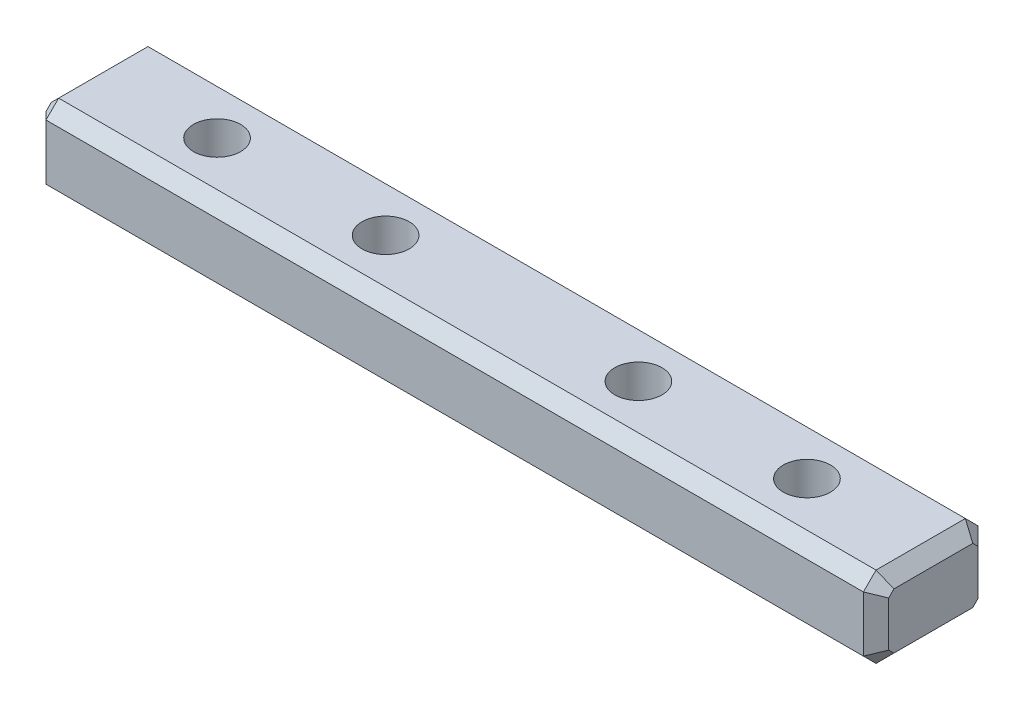
ISO-10303-21;
HEADER;
FILE_DESCRIPTION(('STEP AP214'),'2;1');
FILE_NAME('part.step','',(''),(''),'','','');
FILE_SCHEMA(('AUTOMOTIVE_DESIGN { 1 0 10303 214 1 1 1 1 }'));
ENDSEC;
DATA;
#1=APPLICATION_CONTEXT('core data for automotive mechanical design processes');
#2=APPLICATION_PROTOCOL_DEFINITION('international standard','automotive_design',2000,#1);
#3=PRODUCT_CONTEXT('',#1,'mechanical');
#4=PRODUCT('Part','Part','',(#3));
#5=PRODUCT_RELATED_PRODUCT_CATEGORY('part','',(#4));
#6=PRODUCT_DEFINITION_FORMATION('','',#4);
#7=PRODUCT_DEFINITION_CONTEXT('part definition',#1,'design');
#8=PRODUCT_DEFINITION('design','',#6,#7);
#9=PRODUCT_DEFINITION_SHAPE('','',#8);
#10=(LENGTH_UNIT() NAMED_UNIT(*) SI_UNIT(.MILLI.,.METRE.));
#11=(NAMED_UNIT(*) PLANE_ANGLE_UNIT() SI_UNIT($,.RADIAN.));
#12=(NAMED_UNIT(*) SI_UNIT($,.STERADIAN.) SOLID_ANGLE_UNIT());
#13=UNCERTAINTY_MEASURE_WITH_UNIT(LENGTH_MEASURE(1.E-05),#10,'distance_accuracy_value','');
#14=(GEOMETRIC_REPRESENTATION_CONTEXT(3) GLOBAL_UNCERTAINTY_ASSIGNED_CONTEXT((#13)) GLOBAL_UNIT_ASSIGNED_CONTEXT((#10,
#11,#12)) REPRESENTATION_CONTEXT('',''));
#15=CARTESIAN_POINT('',(0.,0.,0.));
#16=DIRECTION('',(0.,0.,1.));
#17=DIRECTION('',(1.,0.,0.));
#18=AXIS2_PLACEMENT_3D('',#15,#16,#17);
#19=CARTESIAN_POINT('',(0.,4.8,-6.8));
#20=DIRECTION('',(0.,1.,0.));
#21=DIRECTION('',(0.,0.,-1.));
#22=AXIS2_PLACEMENT_3D('',#19,#20,#21);
#23=PLANE('',#22);
#24=CARTESIAN_POINT('',(35.,4.8,0.));
#25=DIRECTION('',(0.,-1.,0.));
#26=DIRECTION('',(1.,0.,0.));
#27=AXIS2_PLACEMENT_3D('',#24,#25,#26);
#28=CIRCLE('',#27,2.8);
#29=CARTESIAN_POINT('',(32.2,4.8,0.));
#30=VERTEX_POINT('',#29);
#31=EDGE_CURVE('E11',#30,#30,#28,.T.);
#32=ORIENTED_EDGE('',*,*,#31,.T.);
#33=EDGE_LOOP('',(#32));
#34=FACE_BOUND('',#33,.T.);
#35=CARTESIAN_POINT('',(-35.,4.8,0.));
#36=DIRECTION('',(0.,-1.,0.));
#37=DIRECTION('',(1.,0.,0.));
#38=AXIS2_PLACEMENT_3D('',#35,#36,#37);
#39=CIRCLE('',#38,2.8);
#40=CARTESIAN_POINT('',(-37.8,4.8,0.));
#41=VERTEX_POINT('',#40);
#42=EDGE_CURVE('E40',#41,#41,#39,.T.);
#43=ORIENTED_EDGE('',*,*,#42,.T.);
#44=EDGE_LOOP('',(#43));
#45=FACE_BOUND('',#44,.T.);
#46=CARTESIAN_POINT('',(15.,4.8,0.));
#47=DIRECTION('',(0.,-1.,0.));
#48=DIRECTION('',(1.,0.,0.));
#49=AXIS2_PLACEMENT_3D('',#46,#47,#48);
#50=CIRCLE('',#49,2.8);
#51=CARTESIAN_POINT('',(12.2,4.8,0.));
#52=VERTEX_POINT('',#51);
#53=EDGE_CURVE('E447',#52,#52,#50,.T.);
#54=ORIENTED_EDGE('',*,*,#53,.T.);
#55=EDGE_LOOP('',(#54));
#56=FACE_BOUND('',#55,.T.);
#57=CARTESIAN_POINT('',(-15.,4.8,0.));
#58=DIRECTION('',(0.,-1.,0.));
#59=DIRECTION('',(1.,0.,0.));
#60=AXIS2_PLACEMENT_3D('',#57,#58,#59);
#61=CIRCLE('',#60,2.8);
#62=CARTESIAN_POINT('',(-17.8,4.8,0.));
#63=VERTEX_POINT('',#62);
#64=EDGE_CURVE('E440',#63,#63,#61,.T.);
#65=ORIENTED_EDGE('',*,*,#64,.T.);
#66=EDGE_LOOP('',(#65));
#67=FACE_BOUND('',#66,.T.);
#68=DIRECTION('',(0.,0.,-1.));
#69=VECTOR('',#68,1.);
#70=CARTESIAN_POINT('',(-48.5,4.8,-3.4));
#71=LINE('',#70,#69);
#72=CARTESIAN_POINT('',(-48.5,4.8,5.3));
#73=VERTEX_POINT('',#72);
#74=CARTESIAN_POINT('',(-48.5,4.8,-5.3));
#75=VERTEX_POINT('',#74);
#76=EDGE_CURVE('E248',#73,#75,#71,.T.);
#77=ORIENTED_EDGE('',*,*,#76,.F.);
#78=DIRECTION('',(-1.,0.,0.));
#79=VECTOR('',#78,1.);
#80=CARTESIAN_POINT('',(0.,4.8,5.3));
#81=LINE('',#80,#79);
#82=CARTESIAN_POINT('',(48.5,4.8,5.3));
#83=VERTEX_POINT('',#82);
#84=EDGE_CURVE('E323',#83,#73,#81,.T.);
#85=ORIENTED_EDGE('',*,*,#84,.F.);
#86=DIRECTION('',(0.,0.,1.));
#87=VECTOR('',#86,1.);
#88=CARTESIAN_POINT('',(48.5,4.8,-3.4));
#89=LINE('',#88,#87);
#90=CARTESIAN_POINT('',(48.5,4.8,-5.3));
#91=VERTEX_POINT('',#90);
#92=EDGE_CURVE('E373',#91,#83,#89,.T.);
#93=ORIENTED_EDGE('',*,*,#92,.F.);
#94=DIRECTION('',(1.,0.,0.));
#95=VECTOR('',#94,1.);
#96=CARTESIAN_POINT('',(0.,4.8,-5.3));
#97=LINE('',#96,#95);
#98=EDGE_CURVE('E356',#75,#91,#97,.T.);
#99=ORIENTED_EDGE('',*,*,#98,.F.);
#100=EDGE_LOOP('',(#77,#85,#93,#99));
#101=FACE_BOUND('',#100,.T.);
#102=ADVANCED_FACE('F17',(#34,#45,#56,#67,#101),#23,.T.);
#103=CARTESIAN_POINT('',(35.,-4.8,0.));
#104=DIRECTION('',(0.,1.,0.));
#105=DIRECTION('',(1.,0.,0.));
#106=AXIS2_PLACEMENT_3D('',#103,#104,#105);
#107=CYLINDRICAL_SURFACE('',#106,2.8);
#108=CARTESIAN_POINT('',(35.,-4.8,0.));
#109=DIRECTION('',(0.,1.,0.));
#110=DIRECTION('',(1.,0.,0.));
#111=AXIS2_PLACEMENT_3D('',#108,#109,#110);
#112=CIRCLE('',#111,2.8);
#113=CARTESIAN_POINT('',(32.2,-4.8,0.));
#114=VERTEX_POINT('',#113);
#115=EDGE_CURVE('E266',#114,#114,#112,.T.);
#116=ORIENTED_EDGE('',*,*,#115,.F.);
#117=DIRECTION('',(0.,1.,0.));
#118=VECTOR('',#117,1.);
#119=CARTESIAN_POINT('',(32.2,-4.8,0.));
#120=LINE('',#119,#118);
#121=EDGE_CURVE('E25',#114,#30,#120,.T.);
#122=ORIENTED_EDGE('',*,*,#121,.T.);
#123=ORIENTED_EDGE('',*,*,#31,.F.);
#124=ORIENTED_EDGE('',*,*,#121,.F.);
#125=EDGE_LOOP('',(#116,#122,#123,#124));
#126=FACE_BOUND('',#125,.T.);
#127=ADVANCED_FACE('F535',(#126),#107,.F.);
#128=CARTESIAN_POINT('',(-35.,-4.8,0.));
#129=DIRECTION('',(0.,1.,0.));
#130=DIRECTION('',(1.,0.,0.));
#131=AXIS2_PLACEMENT_3D('',#128,#129,#130);
#132=CYLINDRICAL_SURFACE('',#131,2.8);
#133=CARTESIAN_POINT('',(-35.,-4.8,0.));
#134=DIRECTION('',(0.,1.,0.));
#135=DIRECTION('',(1.,0.,0.));
#136=AXIS2_PLACEMENT_3D('',#133,#134,#135);
#137=CIRCLE('',#136,2.8);
#138=CARTESIAN_POINT('',(-37.8,-4.8,0.));
#139=VERTEX_POINT('',#138);
#140=EDGE_CURVE('E270',#139,#139,#137,.T.);
#141=ORIENTED_EDGE('',*,*,#140,.F.);
#142=DIRECTION('',(0.,1.,0.));
#143=VECTOR('',#142,1.);
#144=CARTESIAN_POINT('',(-37.8,-4.8,0.));
#145=LINE('',#144,#143);
#146=EDGE_CURVE('E409',#139,#41,#145,.T.);
#147=ORIENTED_EDGE('',*,*,#146,.T.);
#148=ORIENTED_EDGE('',*,*,#42,.F.);
#149=ORIENTED_EDGE('',*,*,#146,.F.);
#150=EDGE_LOOP('',(#141,#147,#148,#149));
#151=FACE_BOUND('',#150,.T.);
#152=ADVANCED_FACE('F455',(#151),#132,.F.);
#153=CARTESIAN_POINT('',(15.,-4.8,0.));
#154=DIRECTION('',(0.,1.,0.));
#155=DIRECTION('',(1.,0.,0.));
#156=AXIS2_PLACEMENT_3D('',#153,#154,#155);
#157=CYLINDRICAL_SURFACE('',#156,2.8);
#158=CARTESIAN_POINT('',(15.,-4.8,0.));
#159=DIRECTION('',(0.,1.,0.));
#160=DIRECTION('',(1.,0.,0.));
#161=AXIS2_PLACEMENT_3D('',#158,#159,#160);
#162=CIRCLE('',#161,2.8);
#163=CARTESIAN_POINT('',(12.2,-4.8,0.));
#164=VERTEX_POINT('',#163);
#165=EDGE_CURVE('E364',#164,#164,#162,.T.);
#166=ORIENTED_EDGE('',*,*,#165,.F.);
#167=DIRECTION('',(0.,1.,0.));
#168=VECTOR('',#167,1.);
#169=CARTESIAN_POINT('',(12.2,-4.8,0.));
#170=LINE('',#169,#168);
#171=EDGE_CURVE('E443',#164,#52,#170,.T.);
#172=ORIENTED_EDGE('',*,*,#171,.T.);
#173=ORIENTED_EDGE('',*,*,#53,.F.);
#174=ORIENTED_EDGE('',*,*,#171,.F.);
#175=EDGE_LOOP('',(#166,#172,#173,#174));
#176=FACE_BOUND('',#175,.T.);
#177=ADVANCED_FACE('F543',(#176),#157,.F.);
#178=CARTESIAN_POINT('',(-15.,-4.8,0.));
#179=DIRECTION('',(0.,1.,0.));
#180=DIRECTION('',(1.,0.,0.));
#181=AXIS2_PLACEMENT_3D('',#178,#179,#180);
#182=CYLINDRICAL_SURFACE('',#181,2.8);
#183=CARTESIAN_POINT('',(-15.,-4.8,0.));
#184=DIRECTION('',(0.,1.,0.));
#185=DIRECTION('',(1.,0.,0.));
#186=AXIS2_PLACEMENT_3D('',#183,#184,#185);
#187=CIRCLE('',#186,2.8);
#188=CARTESIAN_POINT('',(-17.8,-4.8,0.));
#189=VERTEX_POINT('',#188);
#190=EDGE_CURVE('E247',#189,#189,#187,.T.);
#191=ORIENTED_EDGE('',*,*,#190,.F.);
#192=DIRECTION('',(0.,1.,0.));
#193=VECTOR('',#192,1.);
#194=CARTESIAN_POINT('',(-17.8,-4.8,0.));
#195=LINE('',#194,#193);
#196=EDGE_CURVE('E436',#189,#63,#195,.T.);
#197=ORIENTED_EDGE('',*,*,#196,.T.);
#198=ORIENTED_EDGE('',*,*,#64,.F.);
#199=ORIENTED_EDGE('',*,*,#196,.F.);
#200=EDGE_LOOP('',(#191,#197,#198,#199));
#201=FACE_BOUND('',#200,.T.);
#202=ADVANCED_FACE('F548',(#201),#182,.F.);
#203=CARTESIAN_POINT('',(0.,-4.8,-6.8));
#204=DIRECTION('',(0.,0.,-1.));
#205=DIRECTION('',(0.,-1.,0.));
#206=AXIS2_PLACEMENT_3D('',#203,#204,#205);
#207=PLANE('',#206);
#208=DIRECTION('',(0.,-1.,0.));
#209=VECTOR('',#208,1.);
#210=CARTESIAN_POINT('',(-48.5,-2.4,-6.8));
#211=LINE('',#210,#209);
#212=CARTESIAN_POINT('',(-48.5,3.3,-6.8));
#213=VERTEX_POINT('',#212);
#214=CARTESIAN_POINT('',(-48.5,-3.3,-6.8));
#215=VERTEX_POINT('',#214);
#216=EDGE_CURVE('E272',#213,#215,#211,.T.);
#217=ORIENTED_EDGE('',*,*,#216,.F.);
#218=DIRECTION('',(-1.,0.,0.));
#219=VECTOR('',#218,1.);
#220=CARTESIAN_POINT('',(0.,3.3,-6.8));
#221=LINE('',#220,#219);
#222=CARTESIAN_POINT('',(48.5,3.3,-6.8));
#223=VERTEX_POINT('',#222);
#224=EDGE_CURVE('E359',#223,#213,#221,.T.);
#225=ORIENTED_EDGE('',*,*,#224,.F.);
#226=DIRECTION('',(0.,1.,0.));
#227=VECTOR('',#226,1.);
#228=CARTESIAN_POINT('',(48.5,-2.4,-6.8));
#229=LINE('',#228,#227);
#230=CARTESIAN_POINT('',(48.5,-3.3,-6.8));
#231=VERTEX_POINT('',#230);
#232=EDGE_CURVE('E306',#231,#223,#229,.T.);
#233=ORIENTED_EDGE('',*,*,#232,.F.);
#234=DIRECTION('',(1.,0.,0.));
#235=VECTOR('',#234,1.);
#236=CARTESIAN_POINT('',(0.,-3.3,-6.8));
#237=LINE('',#236,#235);
#238=EDGE_CURVE('E360',#215,#231,#237,.T.);
#239=ORIENTED_EDGE('',*,*,#238,.F.);
#240=EDGE_LOOP('',(#217,#225,#233,#239));
#241=FACE_BOUND('',#240,.T.);
#242=ADVANCED_FACE('F522',(#241),#207,.T.);
#243=CARTESIAN_POINT('',(0.,4.05,-6.05));
#244=DIRECTION('',(0.,0.707106781186548,-0.707106781186548));
#245=DIRECTION('',(-1.,0.,0.));
#246=AXIS2_PLACEMENT_3D('',#243,#244,#245);
#247=PLANE('',#246);
#248=DIRECTION('',(0.,-0.707106781186548,-0.707106781186548));
#249=VECTOR('',#248,1.);
#250=CARTESIAN_POINT('',(-48.5,4.55,-5.55));
#251=LINE('',#250,#249);
#252=EDGE_CURVE('E276',#75,#213,#251,.T.);
#253=ORIENTED_EDGE('',*,*,#252,.F.);
#254=ORIENTED_EDGE('',*,*,#98,.T.);
#255=DIRECTION('',(0.,0.707106781186548,0.707106781186548));
#256=VECTOR('',#255,1.);
#257=CARTESIAN_POINT('',(48.5,4.55,-5.55));
#258=LINE('',#257,#256);
#259=EDGE_CURVE('E376',#223,#91,#258,.T.);
#260=ORIENTED_EDGE('',*,*,#259,.F.);
#261=ORIENTED_EDGE('',*,*,#224,.T.);
#262=EDGE_LOOP('',(#253,#254,#260,#261));
#263=FACE_BOUND('',#262,.T.);
#264=ADVANCED_FACE('F512',(#263),#247,.T.);
#265=CARTESIAN_POINT('',(50.,0.,0.));
#266=DIRECTION('',(1.,0.,0.));
#267=DIRECTION('',(0.,1.,0.));
#268=AXIS2_PLACEMENT_3D('',#265,#266,#267);
#269=PLANE('',#268);
#270=DIRECTION('',(0.,1.,0.));
#271=VECTOR('',#270,1.);
#272=CARTESIAN_POINT('',(50.,2.4,5.3));
#273=LINE('',#272,#271);
#274=CARTESIAN_POINT('',(50.,-2.67867965644036,5.3));
#275=VERTEX_POINT('',#274);
#276=CARTESIAN_POINT('',(50.,2.67867965644035,5.3));
#277=VERTEX_POINT('',#276);
#278=EDGE_CURVE('E242',#275,#277,#273,.T.);
#279=ORIENTED_EDGE('',*,*,#278,.F.);
#280=DIRECTION('',(0.,0.707106781186548,0.707106781186547));
#281=VECTOR('',#280,1.);
#282=CARTESIAN_POINT('',(50.,-3.48933982822018,4.48933982822018));
#283=LINE('',#282,#281);
#284=CARTESIAN_POINT('',(50.,-3.3,4.67867965644036));
#285=VERTEX_POINT('',#284);
#286=EDGE_CURVE('E429',#285,#275,#283,.T.);
#287=ORIENTED_EDGE('',*,*,#286,.F.);
#288=DIRECTION('',(0.,0.,1.));
#289=VECTOR('',#288,1.);
#290=CARTESIAN_POINT('',(50.,-3.3,3.4));
#291=LINE('',#290,#289);
#292=CARTESIAN_POINT('',(50.,-3.3,-4.67867965644036));
#293=VERTEX_POINT('',#292);
#294=EDGE_CURVE('E240',#293,#285,#291,.T.);
#295=ORIENTED_EDGE('',*,*,#294,.F.);
#296=DIRECTION('',(0.,-0.707106781186547,0.707106781186548));
#297=VECTOR('',#296,1.);
#298=CARTESIAN_POINT('',(50.,-3.48933982822018,-4.48933982822018));
#299=LINE('',#298,#297);
#300=CARTESIAN_POINT('',(50.,-2.67867965644036,-5.3));
#301=VERTEX_POINT('',#300);
#302=EDGE_CURVE('E241',#301,#293,#299,.T.);
#303=ORIENTED_EDGE('',*,*,#302,.F.);
#304=DIRECTION('',(0.,-1.,0.));
#305=VECTOR('',#304,1.);
#306=CARTESIAN_POINT('',(50.,-2.4,-5.3));
#307=LINE('',#306,#305);
#308=CARTESIAN_POINT('',(50.,2.67867965644036,-5.3));
#309=VERTEX_POINT('',#308);
#310=EDGE_CURVE('E295',#309,#301,#307,.T.);
#311=ORIENTED_EDGE('',*,*,#310,.F.);
#312=DIRECTION('',(0.,-0.707106781186548,-0.707106781186548));
#313=VECTOR('',#312,1.);
#314=CARTESIAN_POINT('',(50.,3.48933982822018,-4.48933982822018));
#315=LINE('',#314,#313);
#316=CARTESIAN_POINT('',(50.,3.3,-4.67867965644036));
#317=VERTEX_POINT('',#316);
#318=EDGE_CURVE('E413',#317,#309,#315,.T.);
#319=ORIENTED_EDGE('',*,*,#318,.F.);
#320=DIRECTION('',(0.,0.,-1.));
#321=VECTOR('',#320,1.);
#322=CARTESIAN_POINT('',(50.,3.3,-3.4));
#323=LINE('',#322,#321);
#324=CARTESIAN_POINT('',(50.,3.3,4.67867965644035));
#325=VERTEX_POINT('',#324);
#326=EDGE_CURVE('E332',#325,#317,#323,.T.);
#327=ORIENTED_EDGE('',*,*,#326,.F.);
#328=DIRECTION('',(0.,0.707106781186547,-0.707106781186548));
#329=VECTOR('',#328,1.);
#330=CARTESIAN_POINT('',(50.,3.48933982822018,4.48933982822018));
#331=LINE('',#330,#329);
#332=EDGE_CURVE('E397',#277,#325,#331,.T.);
#333=ORIENTED_EDGE('',*,*,#332,.F.);
#334=EDGE_LOOP('',(#279,#287,#295,#303,#311,#319,#327,#333));
#335=FACE_BOUND('',#334,.T.);
#336=ADVANCED_FACE('F557',(#335),#269,.T.);
#337=CARTESIAN_POINT('',(0.,-4.05,-6.05));
#338=DIRECTION('',(0.,-0.707106781186548,-0.707106781186547));
#339=DIRECTION('',(0.,0.707106781186547,-0.707106781186548));
#340=AXIS2_PLACEMENT_3D('',#337,#338,#339);
#341=PLANE('',#340);
#342=DIRECTION('',(0.,-0.707106781186547,0.707106781186548));
#343=VECTOR('',#342,1.);
#344=CARTESIAN_POINT('',(-48.5,-4.55,-5.55));
#345=LINE('',#344,#343);
#346=CARTESIAN_POINT('',(-48.5,-4.8,-5.3));
#347=VERTEX_POINT('',#346);
#348=EDGE_CURVE('E281',#215,#347,#345,.T.);
#349=ORIENTED_EDGE('',*,*,#348,.F.);
#350=ORIENTED_EDGE('',*,*,#238,.T.);
#351=DIRECTION('',(0.,0.707106781186547,-0.707106781186548));
#352=VECTOR('',#351,1.);
#353=CARTESIAN_POINT('',(48.5,-4.55,-5.55));
#354=LINE('',#353,#352);
#355=CARTESIAN_POINT('',(48.5,-4.8,-5.3));
#356=VERTEX_POINT('',#355);
#357=EDGE_CURVE('E261',#356,#231,#354,.T.);
#358=ORIENTED_EDGE('',*,*,#357,.F.);
#359=DIRECTION('',(-1.,0.,0.));
#360=VECTOR('',#359,1.);
#361=CARTESIAN_POINT('',(0.,-4.8,-5.3));
#362=LINE('',#361,#360);
#363=EDGE_CURVE('E380',#356,#347,#362,.T.);
#364=ORIENTED_EDGE('',*,*,#363,.T.);
#365=EDGE_LOOP('',(#349,#350,#358,#364));
#366=FACE_BOUND('',#365,.T.);
#367=ADVANCED_FACE('F474',(#366),#341,.T.);
#368=CARTESIAN_POINT('',(49.25,-4.01966991411009,5.01966991411009));
#369=DIRECTION('',(0.707106781186547,-0.5,0.5));
#370=DIRECTION('',(0.,-0.707106781186548,-0.707106781186547));
#371=AXIS2_PLACEMENT_3D('',#368,#369,#370);
#372=PLANE('',#371);
#373=DIRECTION('',(0.,-0.707106781186548,-0.707106781186547));
#374=VECTOR('',#373,1.);
#375=CARTESIAN_POINT('',(48.5,-4.55,5.55));
#376=LINE('',#375,#374);
#377=CARTESIAN_POINT('',(48.5,-3.3,6.8));
#378=VERTEX_POINT('',#377);
#379=CARTESIAN_POINT('',(48.5,-4.8,5.3));
#380=VERTEX_POINT('',#379);
#381=EDGE_CURVE('E372',#378,#380,#376,.T.);
#382=ORIENTED_EDGE('',*,*,#381,.T.);
#383=DIRECTION('',(-0.678598344545848,-0.678598344545846,0.28108463771482));
#384=VECTOR('',#383,1.);
#385=CARTESIAN_POINT('',(50.,-3.3,4.67867965644036));
#386=LINE('',#385,#384);
#387=EDGE_CURVE('E426',#285,#380,#386,.T.);
#388=ORIENTED_EDGE('',*,*,#387,.F.);
#389=ORIENTED_EDGE('',*,*,#286,.T.);
#390=DIRECTION('',(-0.678598344545848,-0.28108463771482,0.678598344545846));
#391=VECTOR('',#390,1.);
#392=CARTESIAN_POINT('',(50.,-2.67867965644036,5.3));
#393=LINE('',#392,#391);
#394=EDGE_CURVE('E394',#275,#378,#393,.T.);
#395=ORIENTED_EDGE('',*,*,#394,.T.);
#396=EDGE_LOOP('',(#382,#388,#389,#395));
#397=FACE_BOUND('',#396,.T.);
#398=ADVANCED_FACE('F484',(#397),#372,.T.);
#399=CARTESIAN_POINT('',(49.25,-4.05,3.4));
#400=DIRECTION('',(0.707106781186547,-0.707106781186548,0.));
#401=DIRECTION('',(0.,0.,-1.));
#402=AXIS2_PLACEMENT_3D('',#399,#400,#401);
#403=PLANE('',#402);
#404=DIRECTION('',(0.,0.,-1.));
#405=VECTOR('',#404,1.);
#406=CARTESIAN_POINT('',(48.5,-4.8,3.4));
#407=LINE('',#406,#405);
#408=EDGE_CURVE('E271',#380,#356,#407,.T.);
#409=ORIENTED_EDGE('',*,*,#408,.T.);
#410=DIRECTION('',(-0.678598344545848,-0.678598344545846,-0.28108463771482));
#411=VECTOR('',#410,1.);
#412=CARTESIAN_POINT('',(50.,-3.3,-4.67867965644036));
#413=LINE('',#412,#411);
#414=EDGE_CURVE('E237',#293,#356,#413,.T.);
#415=ORIENTED_EDGE('',*,*,#414,.F.);
#416=ORIENTED_EDGE('',*,*,#294,.T.);
#417=ORIENTED_EDGE('',*,*,#387,.T.);
#418=EDGE_LOOP('',(#409,#415,#416,#417));
#419=FACE_BOUND('',#418,.T.);
#420=ADVANCED_FACE('F480',(#419),#403,.T.);
#421=CARTESIAN_POINT('',(49.25,-4.01966991411009,-5.01966991411009));
#422=DIRECTION('',(0.707106781186547,-0.5,-0.5));
#423=DIRECTION('',(0.,0.707106781186547,-0.707106781186548));
#424=AXIS2_PLACEMENT_3D('',#421,#422,#423);
#425=PLANE('',#424);
#426=ORIENTED_EDGE('',*,*,#357,.T.);
#427=DIRECTION('',(-0.678598344545848,-0.281084637714821,-0.678598344545846));
#428=VECTOR('',#427,1.);
#429=CARTESIAN_POINT('',(50.,-2.67867965644036,-5.3));
#430=LINE('',#429,#428);
#431=EDGE_CURVE('E265',#301,#231,#430,.T.);
#432=ORIENTED_EDGE('',*,*,#431,.F.);
#433=ORIENTED_EDGE('',*,*,#302,.T.);
#434=ORIENTED_EDGE('',*,*,#414,.T.);
#435=EDGE_LOOP('',(#426,#432,#433,#434));
#436=FACE_BOUND('',#435,.T.);
#437=ADVANCED_FACE('F565',(#436),#425,.T.);
#438=CARTESIAN_POINT('',(49.25,-2.4,-6.05));
#439=DIRECTION('',(0.707106781186547,0.,-0.707106781186548));
#440=DIRECTION('',(0.,-1.,0.));
#441=AXIS2_PLACEMENT_3D('',#438,#439,#440);
#442=PLANE('',#441);
#443=ORIENTED_EDGE('',*,*,#232,.T.);
#444=DIRECTION('',(-0.678598344545848,0.28108463771482,-0.678598344545846));
#445=VECTOR('',#444,1.);
#446=CARTESIAN_POINT('',(50.,2.67867965644036,-5.3));
#447=LINE('',#446,#445);
#448=EDGE_CURVE('E310',#309,#223,#447,.T.);
#449=ORIENTED_EDGE('',*,*,#448,.F.);
#450=ORIENTED_EDGE('',*,*,#310,.T.);
#451=ORIENTED_EDGE('',*,*,#431,.T.);
#452=EDGE_LOOP('',(#443,#449,#450,#451));
#453=FACE_BOUND('',#452,.T.);
#454=ADVANCED_FACE('F518',(#453),#442,.T.);
#455=CARTESIAN_POINT('',(49.25,4.01966991411009,-5.01966991411009));
#456=DIRECTION('',(0.707106781186547,0.5,-0.5));
#457=DIRECTION('',(0.,-0.707106781186548,-0.707106781186548));
#458=AXIS2_PLACEMENT_3D('',#455,#456,#457);
#459=PLANE('',#458);
#460=ORIENTED_EDGE('',*,*,#259,.T.);
#461=DIRECTION('',(-0.678598344545848,0.678598344545846,-0.28108463771482));
#462=VECTOR('',#461,1.);
#463=CARTESIAN_POINT('',(50.,3.3,-4.67867965644036));
#464=LINE('',#463,#462);
#465=EDGE_CURVE('E336',#317,#91,#464,.T.);
#466=ORIENTED_EDGE('',*,*,#465,.F.);
#467=ORIENTED_EDGE('',*,*,#318,.T.);
#468=ORIENTED_EDGE('',*,*,#448,.T.);
#469=EDGE_LOOP('',(#460,#466,#467,#468));
#470=FACE_BOUND('',#469,.T.);
#471=ADVANCED_FACE('F515',(#470),#459,.T.);
#472=CARTESIAN_POINT('',(49.25,4.05,-3.4));
#473=DIRECTION('',(0.707106781186547,0.707106781186548,0.));
#474=DIRECTION('',(0.,0.,-1.));
#475=AXIS2_PLACEMENT_3D('',#472,#473,#474);
#476=PLANE('',#475);
#477=ORIENTED_EDGE('',*,*,#326,.T.);
#478=ORIENTED_EDGE('',*,*,#465,.T.);
#479=ORIENTED_EDGE('',*,*,#92,.T.);
#480=DIRECTION('',(-0.678598344545848,0.678598344545846,0.281084637714821));
#481=VECTOR('',#480,1.);
#482=CARTESIAN_POINT('',(50.,3.3,4.67867965644035));
#483=LINE('',#482,#481);
#484=EDGE_CURVE('E337',#325,#83,#483,.T.);
#485=ORIENTED_EDGE('',*,*,#484,.F.);
#486=EDGE_LOOP('',(#477,#478,#479,#485));
#487=FACE_BOUND('',#486,.T.);
#488=ADVANCED_FACE('F570',(#487),#476,.T.);
#489=CARTESIAN_POINT('',(49.25,4.01966991411009,5.01966991411009));
#490=DIRECTION('',(0.707106781186547,0.5,0.5));
#491=DIRECTION('',(0.,0.707106781186547,-0.707106781186548));
#492=AXIS2_PLACEMENT_3D('',#489,#490,#491);
#493=PLANE('',#492);
#494=ORIENTED_EDGE('',*,*,#332,.T.);
#495=ORIENTED_EDGE('',*,*,#484,.T.);
#496=DIRECTION('',(0.,-0.707106781186547,0.707106781186548));
#497=VECTOR('',#496,1.);
#498=CARTESIAN_POINT('',(48.5,4.55,5.55));
#499=LINE('',#498,#497);
#500=CARTESIAN_POINT('',(48.5,3.3,6.8));
#501=VERTEX_POINT('',#500);
#502=EDGE_CURVE('E327',#83,#501,#499,.T.);
#503=ORIENTED_EDGE('',*,*,#502,.T.);
#504=DIRECTION('',(-0.678598344545848,0.281084637714821,0.678598344545846));
#505=VECTOR('',#504,1.);
#506=CARTESIAN_POINT('',(50.,2.67867965644035,5.3));
#507=LINE('',#506,#505);
#508=EDGE_CURVE('E246',#277,#501,#507,.T.);
#509=ORIENTED_EDGE('',*,*,#508,.F.);
#510=EDGE_LOOP('',(#494,#495,#503,#509));
#511=FACE_BOUND('',#510,.T.);
#512=ADVANCED_FACE('F573',(#511),#493,.T.);
#513=CARTESIAN_POINT('',(49.25,2.4,6.05));
#514=DIRECTION('',(0.707106781186547,0.,0.707106781186548));
#515=DIRECTION('',(0.,-1.,0.));
#516=AXIS2_PLACEMENT_3D('',#513,#514,#515);
#517=PLANE('',#516);
#518=ORIENTED_EDGE('',*,*,#278,.T.);
#519=ORIENTED_EDGE('',*,*,#508,.T.);
#520=DIRECTION('',(0.,-1.,0.));
#521=VECTOR('',#520,1.);
#522=CARTESIAN_POINT('',(48.5,2.4,6.8));
#523=LINE('',#522,#521);
#524=EDGE_CURVE('E355',#501,#378,#523,.T.);
#525=ORIENTED_EDGE('',*,*,#524,.T.);
#526=ORIENTED_EDGE('',*,*,#394,.F.);
#527=EDGE_LOOP('',(#518,#519,#525,#526));
#528=FACE_BOUND('',#527,.T.);
#529=ADVANCED_FACE('F575',(#528),#517,.T.);
#530=CARTESIAN_POINT('',(-50.,0.,0.));
#531=DIRECTION('',(-1.,0.,0.));
#532=DIRECTION('',(0.,0.,1.));
#533=AXIS2_PLACEMENT_3D('',#530,#531,#532);
#534=PLANE('',#533);
#535=DIRECTION('',(0.,0.,-1.));
#536=VECTOR('',#535,1.);
#537=CARTESIAN_POINT('',(-50.,-3.3,3.4));
#538=LINE('',#537,#536);
#539=CARTESIAN_POINT('',(-50.,-3.3,4.67867965644036));
#540=VERTEX_POINT('',#539);
#541=CARTESIAN_POINT('',(-50.,-3.3,-4.67867965644036));
#542=VERTEX_POINT('',#541);
#543=EDGE_CURVE('E215',#540,#542,#538,.T.);
#544=ORIENTED_EDGE('',*,*,#543,.F.);
#545=DIRECTION('',(0.,-0.707106781186548,-0.707106781186547));
#546=VECTOR('',#545,1.);
#547=CARTESIAN_POINT('',(-50.,-3.48933982822018,4.48933982822018));
#548=LINE('',#547,#546);
#549=CARTESIAN_POINT('',(-50.,-2.67867965644036,5.3));
#550=VERTEX_POINT('',#549);
#551=EDGE_CURVE('E196',#550,#540,#548,.T.);
#552=ORIENTED_EDGE('',*,*,#551,.F.);
#553=DIRECTION('',(0.,-1.,0.));
#554=VECTOR('',#553,1.);
#555=CARTESIAN_POINT('',(-50.,2.4,5.3));
#556=LINE('',#555,#554);
#557=CARTESIAN_POINT('',(-50.,2.67867965644035,5.3));
#558=VERTEX_POINT('',#557);
#559=EDGE_CURVE('E341',#558,#550,#556,.T.);
#560=ORIENTED_EDGE('',*,*,#559,.F.);
#561=DIRECTION('',(0.,-0.707106781186547,0.707106781186548));
#562=VECTOR('',#561,1.);
#563=CARTESIAN_POINT('',(-50.,3.48933982822018,4.48933982822018));
#564=LINE('',#563,#562);
#565=CARTESIAN_POINT('',(-50.,3.3,4.67867965644036));
#566=VERTEX_POINT('',#565);
#567=EDGE_CURVE('E318',#566,#558,#564,.T.);
#568=ORIENTED_EDGE('',*,*,#567,.F.);
#569=DIRECTION('',(0.,0.,1.));
#570=VECTOR('',#569,1.);
#571=CARTESIAN_POINT('',(-50.,3.3,-3.4));
#572=LINE('',#571,#570);
#573=CARTESIAN_POINT('',(-50.,3.3,-4.67867965644036));
#574=VERTEX_POINT('',#573);
#575=EDGE_CURVE('E251',#574,#566,#572,.T.);
#576=ORIENTED_EDGE('',*,*,#575,.F.);
#577=DIRECTION('',(0.,0.707106781186548,0.707106781186548));
#578=VECTOR('',#577,1.);
#579=CARTESIAN_POINT('',(-50.,3.48933982822018,-4.48933982822018));
#580=LINE('',#579,#578);
#581=CARTESIAN_POINT('',(-50.,2.67867965644036,-5.3));
#582=VERTEX_POINT('',#581);
#583=EDGE_CURVE('E299',#582,#574,#580,.T.);
#584=ORIENTED_EDGE('',*,*,#583,.F.);
#585=DIRECTION('',(0.,1.,0.));
#586=VECTOR('',#585,1.);
#587=CARTESIAN_POINT('',(-50.,-2.4,-5.3));
#588=LINE('',#587,#586);
#589=CARTESIAN_POINT('',(-50.,-2.67867965644036,-5.3));
#590=VERTEX_POINT('',#589);
#591=EDGE_CURVE('E285',#590,#582,#588,.T.);
#592=ORIENTED_EDGE('',*,*,#591,.F.);
#593=DIRECTION('',(0.,0.707106781186547,-0.707106781186548));
#594=VECTOR('',#593,1.);
#595=CARTESIAN_POINT('',(-50.,-3.48933982822018,-4.48933982822018));
#596=LINE('',#595,#594);
#597=EDGE_CURVE('E219',#542,#590,#596,.T.);
#598=ORIENTED_EDGE('',*,*,#597,.F.);
#599=EDGE_LOOP('',(#544,#552,#560,#568,#576,#584,#592,#598));
#600=FACE_BOUND('',#599,.T.);
#601=ADVANCED_FACE('F221',(#600),#534,.T.);
#602=CARTESIAN_POINT('',(0.,-4.8,6.8));
#603=DIRECTION('',(0.,-1.,0.));
#604=DIRECTION('',(-1.,0.,0.));
#605=AXIS2_PLACEMENT_3D('',#602,#603,#604);
#606=PLANE('',#605);
#607=ORIENTED_EDGE('',*,*,#190,.T.);
#608=EDGE_LOOP('',(#607));
#609=FACE_BOUND('',#608,.T.);
#610=ORIENTED_EDGE('',*,*,#165,.T.);
#611=EDGE_LOOP('',(#610));
#612=FACE_BOUND('',#611,.T.);
#613=ORIENTED_EDGE('',*,*,#140,.T.);
#614=EDGE_LOOP('',(#613));
#615=FACE_BOUND('',#614,.T.);
#616=ORIENTED_EDGE('',*,*,#115,.T.);
#617=EDGE_LOOP('',(#616));
#618=FACE_BOUND('',#617,.T.);
#619=DIRECTION('',(0.,0.,1.));
#620=VECTOR('',#619,1.);
#621=CARTESIAN_POINT('',(-48.5,-4.8,3.4));
#622=LINE('',#621,#620);
#623=CARTESIAN_POINT('',(-48.5,-4.8,5.3));
#624=VERTEX_POINT('',#623);
#625=EDGE_CURVE('E217',#347,#624,#622,.T.);
#626=ORIENTED_EDGE('',*,*,#625,.F.);
#627=ORIENTED_EDGE('',*,*,#363,.F.);
#628=ORIENTED_EDGE('',*,*,#408,.F.);
#629=DIRECTION('',(1.,0.,0.));
#630=VECTOR('',#629,1.);
#631=CARTESIAN_POINT('',(0.,-4.8,5.3));
#632=LINE('',#631,#630);
#633=EDGE_CURVE('E368',#624,#380,#632,.T.);
#634=ORIENTED_EDGE('',*,*,#633,.F.);
#635=EDGE_LOOP('',(#626,#627,#628,#634));
#636=FACE_BOUND('',#635,.T.);
#637=ADVANCED_FACE('F457',(#609,#612,#615,#618,#636),#606,.T.);
#638=CARTESIAN_POINT('',(0.,-4.05,6.05));
#639=DIRECTION('',(0.,-0.707106781186547,0.707106781186548));
#640=DIRECTION('',(-1.,0.,0.));
#641=AXIS2_PLACEMENT_3D('',#638,#639,#640);
#642=PLANE('',#641);
#643=DIRECTION('',(0.,0.707106781186548,0.707106781186547));
#644=VECTOR('',#643,1.);
#645=CARTESIAN_POINT('',(-48.5,-4.55,5.55));
#646=LINE('',#645,#644);
#647=CARTESIAN_POINT('',(-48.5,-3.3,6.8));
#648=VERTEX_POINT('',#647);
#649=EDGE_CURVE('E209',#624,#648,#646,.T.);
#650=ORIENTED_EDGE('',*,*,#649,.F.);
#651=ORIENTED_EDGE('',*,*,#633,.T.);
#652=ORIENTED_EDGE('',*,*,#381,.F.);
#653=DIRECTION('',(-1.,0.,0.));
#654=VECTOR('',#653,1.);
#655=CARTESIAN_POINT('',(0.,-3.3,6.8));
#656=LINE('',#655,#654);
#657=EDGE_CURVE('E326',#378,#648,#656,.T.);
#658=ORIENTED_EDGE('',*,*,#657,.T.);
#659=EDGE_LOOP('',(#650,#651,#652,#658));
#660=FACE_BOUND('',#659,.T.);
#661=ADVANCED_FACE('F460',(#660),#642,.T.);
#662=CARTESIAN_POINT('',(0.,4.8,6.8));
#663=DIRECTION('',(0.,0.,1.));
#664=DIRECTION('',(1.,0.,0.));
#665=AXIS2_PLACEMENT_3D('',#662,#663,#664);
#666=PLANE('',#665);
#667=DIRECTION('',(0.,1.,0.));
#668=VECTOR('',#667,1.);
#669=CARTESIAN_POINT('',(-48.5,2.4,6.8));
#670=LINE('',#669,#668);
#671=CARTESIAN_POINT('',(-48.5,3.3,6.8));
#672=VERTEX_POINT('',#671);
#673=EDGE_CURVE('E331',#648,#672,#670,.T.);
#674=ORIENTED_EDGE('',*,*,#673,.F.);
#675=ORIENTED_EDGE('',*,*,#657,.F.);
#676=ORIENTED_EDGE('',*,*,#524,.F.);
#677=DIRECTION('',(1.,0.,0.));
#678=VECTOR('',#677,1.);
#679=CARTESIAN_POINT('',(0.,3.3,6.8));
#680=LINE('',#679,#678);
#681=EDGE_CURVE('E208',#672,#501,#680,.T.);
#682=ORIENTED_EDGE('',*,*,#681,.F.);
#683=EDGE_LOOP('',(#674,#675,#676,#682));
#684=FACE_BOUND('',#683,.T.);
#685=ADVANCED_FACE('F493',(#684),#666,.T.);
#686=CARTESIAN_POINT('',(0.,4.05,6.05));
#687=DIRECTION('',(0.,0.707106781186548,0.707106781186547));
#688=DIRECTION('',(1.,0.,0.));
#689=AXIS2_PLACEMENT_3D('',#686,#687,#688);
#690=PLANE('',#689);
#691=DIRECTION('',(0.,0.707106781186547,-0.707106781186548));
#692=VECTOR('',#691,1.);
#693=CARTESIAN_POINT('',(-48.5,4.55,5.55));
#694=LINE('',#693,#692);
#695=EDGE_CURVE('E314',#672,#73,#694,.T.);
#696=ORIENTED_EDGE('',*,*,#695,.F.);
#697=ORIENTED_EDGE('',*,*,#681,.T.);
#698=ORIENTED_EDGE('',*,*,#502,.F.);
#699=ORIENTED_EDGE('',*,*,#84,.T.);
#700=EDGE_LOOP('',(#696,#697,#698,#699));
#701=FACE_BOUND('',#700,.T.);
#702=ADVANCED_FACE('F498',(#701),#690,.T.);
#703=CARTESIAN_POINT('',(-49.25,-4.01966991411009,5.01966991411009));
#704=DIRECTION('',(-0.707106781186547,-0.5,0.5));
#705=DIRECTION('',(-0.577350269189626,0.816496580927726,0.));
#706=AXIS2_PLACEMENT_3D('',#703,#704,#705);
#707=PLANE('',#706);
#708=ORIENTED_EDGE('',*,*,#649,.T.);
#709=DIRECTION('',(0.678598344545848,-0.281084637714821,0.678598344545846));
#710=VECTOR('',#709,1.);
#711=CARTESIAN_POINT('',(-50.,-2.67867965644036,5.3));
#712=LINE('',#711,#710);
#713=EDGE_CURVE('E203',#550,#648,#712,.T.);
#714=ORIENTED_EDGE('',*,*,#713,.F.);
#715=ORIENTED_EDGE('',*,*,#551,.T.);
#716=DIRECTION('',(0.678598344545848,-0.678598344545846,0.28108463771482));
#717=VECTOR('',#716,1.);
#718=CARTESIAN_POINT('',(-50.,-3.3,4.67867965644036));
#719=LINE('',#718,#717);
#720=EDGE_CURVE('E200',#540,#624,#719,.T.);
#721=ORIENTED_EDGE('',*,*,#720,.T.);
#722=EDGE_LOOP('',(#708,#714,#715,#721));
#723=FACE_BOUND('',#722,.T.);
#724=ADVANCED_FACE('F199',(#723),#707,.T.);
#725=CARTESIAN_POINT('',(-49.25,2.4,6.05));
#726=DIRECTION('',(-0.707106781186547,0.,0.707106781186548));
#727=DIRECTION('',(0.,1.,0.));
#728=AXIS2_PLACEMENT_3D('',#725,#726,#727);
#729=PLANE('',#728);
#730=ORIENTED_EDGE('',*,*,#673,.T.);
#731=DIRECTION('',(0.678598344545848,0.281084637714821,0.678598344545846));
#732=VECTOR('',#731,1.);
#733=CARTESIAN_POINT('',(-50.,2.67867965644035,5.3));
#734=LINE('',#733,#732);
#735=EDGE_CURVE('E322',#558,#672,#734,.T.);
#736=ORIENTED_EDGE('',*,*,#735,.F.);
#737=ORIENTED_EDGE('',*,*,#559,.T.);
#738=ORIENTED_EDGE('',*,*,#713,.T.);
#739=EDGE_LOOP('',(#730,#736,#737,#738));
#740=FACE_BOUND('',#739,.T.);
#741=ADVANCED_FACE('F490',(#740),#729,.T.);
#742=CARTESIAN_POINT('',(-49.25,4.01966991411009,5.01966991411009));
#743=DIRECTION('',(-0.707106781186547,0.5,0.5));
#744=DIRECTION('',(0.577350269189626,0.,0.816496580927726));
#745=AXIS2_PLACEMENT_3D('',#742,#743,#744);
#746=PLANE('',#745);
#747=ORIENTED_EDGE('',*,*,#695,.T.);
#748=DIRECTION('',(0.678598344545848,0.678598344545846,0.28108463771482));
#749=VECTOR('',#748,1.);
#750=CARTESIAN_POINT('',(-50.,3.3,4.67867965644036));
#751=LINE('',#750,#749);
#752=EDGE_CURVE('E257',#566,#73,#751,.T.);
#753=ORIENTED_EDGE('',*,*,#752,.F.);
#754=ORIENTED_EDGE('',*,*,#567,.T.);
#755=ORIENTED_EDGE('',*,*,#735,.T.);
#756=EDGE_LOOP('',(#747,#753,#754,#755));
#757=FACE_BOUND('',#756,.T.);
#758=ADVANCED_FACE('F502',(#757),#746,.T.);
#759=CARTESIAN_POINT('',(-49.25,4.05,-3.4));
#760=DIRECTION('',(-0.707106781186547,0.707106781186548,0.));
#761=DIRECTION('',(0.,0.,1.));
#762=AXIS2_PLACEMENT_3D('',#759,#760,#761);
#763=PLANE('',#762);
#764=ORIENTED_EDGE('',*,*,#76,.T.);
#765=DIRECTION('',(0.678598344545848,0.678598344545846,-0.28108463771482));
#766=VECTOR('',#765,1.);
#767=CARTESIAN_POINT('',(-50.,3.3,-4.67867965644036));
#768=LINE('',#767,#766);
#769=EDGE_CURVE('E252',#574,#75,#768,.T.);
#770=ORIENTED_EDGE('',*,*,#769,.F.);
#771=ORIENTED_EDGE('',*,*,#575,.T.);
#772=ORIENTED_EDGE('',*,*,#752,.T.);
#773=EDGE_LOOP('',(#764,#770,#771,#772));
#774=FACE_BOUND('',#773,.T.);
#775=ADVANCED_FACE('F505',(#774),#763,.T.);
#776=CARTESIAN_POINT('',(-49.25,4.01966991411009,-5.01966991411009));
#777=DIRECTION('',(-0.707106781186547,0.5,-0.5));
#778=DIRECTION('',(-0.577350269189627,0.,0.816496580927725));
#779=AXIS2_PLACEMENT_3D('',#776,#777,#778);
#780=PLANE('',#779);
#781=ORIENTED_EDGE('',*,*,#252,.T.);
#782=DIRECTION('',(0.678598344545848,0.28108463771482,-0.678598344545846));
#783=VECTOR('',#782,1.);
#784=CARTESIAN_POINT('',(-50.,2.67867965644036,-5.3));
#785=LINE('',#784,#783);
#786=EDGE_CURVE('E277',#582,#213,#785,.T.);
#787=ORIENTED_EDGE('',*,*,#786,.F.);
#788=ORIENTED_EDGE('',*,*,#583,.T.);
#789=ORIENTED_EDGE('',*,*,#769,.T.);
#790=EDGE_LOOP('',(#781,#787,#788,#789));
#791=FACE_BOUND('',#790,.T.);
#792=ADVANCED_FACE('F525',(#791),#780,.T.);
#793=CARTESIAN_POINT('',(-49.25,-2.4,-6.05));
#794=DIRECTION('',(-0.707106781186547,0.,-0.707106781186548));
#795=DIRECTION('',(-0.707106781186548,0.,0.707106781186547));
#796=AXIS2_PLACEMENT_3D('',#793,#794,#795);
#797=PLANE('',#796);
#798=ORIENTED_EDGE('',*,*,#591,.T.);
#799=ORIENTED_EDGE('',*,*,#786,.T.);
#800=ORIENTED_EDGE('',*,*,#216,.T.);
#801=DIRECTION('',(0.678598344545848,-0.281084637714821,-0.678598344545846));
#802=VECTOR('',#801,1.);
#803=CARTESIAN_POINT('',(-50.,-2.67867965644036,-5.3));
#804=LINE('',#803,#802);
#805=EDGE_CURVE('E260',#590,#215,#804,.T.);
#806=ORIENTED_EDGE('',*,*,#805,.F.);
#807=EDGE_LOOP('',(#798,#799,#800,#806));
#808=FACE_BOUND('',#807,.T.);
#809=ADVANCED_FACE('F599',(#808),#797,.T.);
#810=CARTESIAN_POINT('',(-49.25,-4.01966991411009,-5.01966991411009));
#811=DIRECTION('',(-0.707106781186547,-0.5,-0.5));
#812=DIRECTION('',(-0.577350269189627,0.816496580927725,0.));
#813=AXIS2_PLACEMENT_3D('',#810,#811,#812);
#814=PLANE('',#813);
#815=ORIENTED_EDGE('',*,*,#597,.T.);
#816=ORIENTED_EDGE('',*,*,#805,.T.);
#817=ORIENTED_EDGE('',*,*,#348,.T.);
#818=DIRECTION('',(0.678598344545848,-0.678598344545846,-0.28108463771482));
#819=VECTOR('',#818,1.);
#820=CARTESIAN_POINT('',(-50.,-3.3,-4.67867965644036));
#821=LINE('',#820,#819);
#822=EDGE_CURVE('E225',#542,#347,#821,.T.);
#823=ORIENTED_EDGE('',*,*,#822,.F.);
#824=EDGE_LOOP('',(#815,#816,#817,#823));
#825=FACE_BOUND('',#824,.T.);
#826=ADVANCED_FACE('F470',(#825),#814,.T.);
#827=CARTESIAN_POINT('',(-49.25,-4.05,3.4));
#828=DIRECTION('',(-0.707106781186547,-0.707106781186548,0.));
#829=DIRECTION('',(-0.707106781186548,0.707106781186547,0.));
#830=AXIS2_PLACEMENT_3D('',#827,#828,#829);
#831=PLANE('',#830);
#832=ORIENTED_EDGE('',*,*,#543,.T.);
#833=ORIENTED_EDGE('',*,*,#822,.T.);
#834=ORIENTED_EDGE('',*,*,#625,.T.);
#835=ORIENTED_EDGE('',*,*,#720,.F.);
#836=EDGE_LOOP('',(#832,#833,#834,#835));
#837=FACE_BOUND('',#836,.T.);
#838=ADVANCED_FACE('F213',(#837),#831,.T.);
#839=CLOSED_SHELL('',(#102,#127,#152,#177,#202,#242,#264,#336,#367,#398,#420,#437,#454,#471,
#488,#512,#529,#601,#637,#661,#685,#702,#724,#741,#758,#775,#792,#809,#826,#838));
#840=MANIFOLD_SOLID_BREP('B1',#839);
#841=ADVANCED_BREP_SHAPE_REPRESENTATION('',(#18,#840),#14);
#842=SHAPE_DEFINITION_REPRESENTATION(#9,#841);
ENDSEC;
END-ISO-10303-21;
